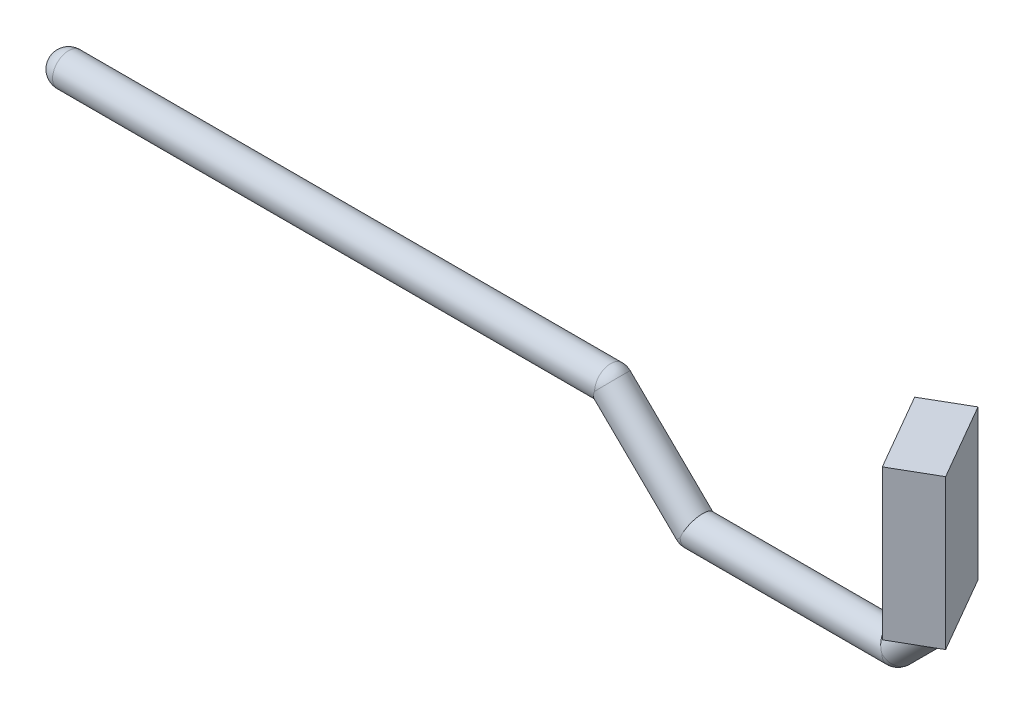
ISO-10303-21;
HEADER;
FILE_DESCRIPTION(('STEP AP214'),'2;1');
FILE_NAME('part.step','',(''),(''),'','','');
FILE_SCHEMA(('AUTOMOTIVE_DESIGN { 1 0 10303 214 1 1 1 1 }'));
ENDSEC;
DATA;
#1=APPLICATION_CONTEXT('core data for automotive mechanical design processes');
#2=APPLICATION_PROTOCOL_DEFINITION('international standard','automotive_design',2000,#1);
#3=PRODUCT_CONTEXT('',#1,'mechanical');
#4=PRODUCT('Part','Part','',(#3));
#5=PRODUCT_RELATED_PRODUCT_CATEGORY('part','',(#4));
#6=PRODUCT_DEFINITION_FORMATION('','',#4);
#7=PRODUCT_DEFINITION_CONTEXT('part definition',#1,'design');
#8=PRODUCT_DEFINITION('design','',#6,#7);
#9=PRODUCT_DEFINITION_SHAPE('','',#8);
#10=(LENGTH_UNIT() NAMED_UNIT(*) SI_UNIT(.MILLI.,.METRE.));
#11=(NAMED_UNIT(*) PLANE_ANGLE_UNIT() SI_UNIT($,.RADIAN.));
#12=(NAMED_UNIT(*) SI_UNIT($,.STERADIAN.) SOLID_ANGLE_UNIT());
#13=UNCERTAINTY_MEASURE_WITH_UNIT(LENGTH_MEASURE(1.E-05),#10,'distance_accuracy_value','');
#14=(GEOMETRIC_REPRESENTATION_CONTEXT(3) GLOBAL_UNCERTAINTY_ASSIGNED_CONTEXT((#13)) GLOBAL_UNIT_ASSIGNED_CONTEXT((#10,
#11,#12)) REPRESENTATION_CONTEXT('',''));
#15=CARTESIAN_POINT('',(0.,0.,0.));
#16=DIRECTION('',(0.,0.,1.));
#17=DIRECTION('',(1.,0.,0.));
#18=AXIS2_PLACEMENT_3D('',#15,#16,#17);
#19=CARTESIAN_POINT('',(62.,-60.75,197.625));
#20=DIRECTION('',(0.,0.,1.));
#21=DIRECTION('',(1.,0.,0.));
#22=AXIS2_PLACEMENT_3D('',#19,#20,#21);
#23=SPHERICAL_SURFACE('',#22,2.25);
#24=CARTESIAN_POINT('',(62.,-60.75,197.625));
#25=DIRECTION('',(-1.,0.,0.));
#26=DIRECTION('',(0.,0.,-1.));
#27=AXIS2_PLACEMENT_3D('',#24,#25,#26);
#28=SPHERICAL_SURFACE('',#27,2.25);
#29=CARTESIAN_POINT('',(62.,-60.75,197.625));
#30=DIRECTION('',(-1.,0.,0.));
#31=DIRECTION('',(0.,0.,-1.));
#32=AXIS2_PLACEMENT_3D('',#29,#30,#31);
#33=CIRCLE('',#32,2.25);
#34=CARTESIAN_POINT('',(62.,-60.75,195.375));
#35=VERTEX_POINT('',#34);
#36=CARTESIAN_POINT('',(62.,-60.75,199.875));
#37=VERTEX_POINT('',#36);
#38=EDGE_CURVE('E9',#35,#37,#33,.T.);
#39=ORIENTED_EDGE('',*,*,#38,.T.);
#40=CARTESIAN_POINT('',(62.,-60.75,197.625));
#41=DIRECTION('',(-1.,0.,0.));
#42=DIRECTION('',(0.,0.,-1.));
#43=AXIS2_PLACEMENT_3D('',#40,#41,#42);
#44=CIRCLE('',#43,2.25);
#45=EDGE_CURVE('E25',#37,#35,#44,.T.);
#46=ORIENTED_EDGE('',*,*,#45,.T.);
#47=EDGE_LOOP('',(#39,#46));
#48=FACE_BOUND('',#47,.T.);
#49=ADVANCED_FACE('F14',(#48),#28,.T.);
#50=CARTESIAN_POINT('',(138.,-60.75,197.625));
#51=DIRECTION('',(-1.,0.,0.));
#52=DIRECTION('',(0.,0.,-1.));
#53=AXIS2_PLACEMENT_3D('',#50,#51,#52);
#54=CYLINDRICAL_SURFACE('',#53,2.25);
#55=CARTESIAN_POINT('',(138.,-60.75,197.625));
#56=DIRECTION('',(-1.,0.,0.));
#57=DIRECTION('',(0.,0.,-1.));
#58=AXIS2_PLACEMENT_3D('',#55,#56,#57);
#59=CIRCLE('',#58,2.25);
#60=CARTESIAN_POINT('',(138.,-60.75,199.875));
#61=VERTEX_POINT('',#60);
#62=CARTESIAN_POINT('',(138.,-60.75,195.375));
#63=VERTEX_POINT('',#62);
#64=EDGE_CURVE('E167',#61,#63,#59,.T.);
#65=ORIENTED_EDGE('',*,*,#64,.T.);
#66=DIRECTION('',(-1.,0.,0.));
#67=VECTOR('',#66,1.);
#68=CARTESIAN_POINT('',(138.,-60.75,195.375));
#69=LINE('',#68,#67);
#70=EDGE_CURVE('E163',#63,#35,#69,.T.);
#71=ORIENTED_EDGE('',*,*,#70,.T.);
#72=ORIENTED_EDGE('',*,*,#45,.F.);
#73=ORIENTED_EDGE('',*,*,#38,.F.);
#74=ORIENTED_EDGE('',*,*,#70,.F.);
#75=CARTESIAN_POINT('',(138.,-60.75,197.625));
#76=DIRECTION('',(-0.925880777015539,0.37781581061822,0.));
#77=DIRECTION('',(0.37781581061822,0.925880777015539,0.));
#78=AXIS2_PLACEMENT_3D('',#75,#76,#77);
#79=ELLIPSE('',#78,2.430118494579,2.25);
#80=CARTESIAN_POINT('',(137.08186281107,-62.99999999999,197.625));
#81=VERTEX_POINT('',#80);
#82=EDGE_CURVE('E212',#63,#81,#79,.T.);
#83=ORIENTED_EDGE('',*,*,#82,.T.);
#84=CARTESIAN_POINT('',(138.,-60.75,197.625));
#85=DIRECTION('',(-0.925880777015539,0.37781581061822,0.));
#86=DIRECTION('',(0.37781581061822,0.925880777015539,0.));
#87=AXIS2_PLACEMENT_3D('',#84,#85,#86);
#88=ELLIPSE('',#87,2.430118494579,2.25);
#89=EDGE_CURVE('E227',#81,#61,#88,.T.);
#90=ORIENTED_EDGE('',*,*,#89,.T.);
#91=EDGE_LOOP('',(#65,#71,#72,#73,#74,#83,#90));
#92=FACE_BOUND('',#91,.T.);
#93=ADVANCED_FACE('F262',(#92),#54,.T.);
#94=CARTESIAN_POINT('',(138.,-60.75,197.625));
#95=DIRECTION('',(0.,0.,1.));
#96=DIRECTION('',(1.,0.,0.));
#97=AXIS2_PLACEMENT_3D('',#94,#95,#96);
#98=SPHERICAL_SURFACE('',#97,2.25);
#99=CARTESIAN_POINT('',(138.,-60.75,197.625));
#100=DIRECTION('',(-0.714510426493359,0.699624792608351,0.));
#101=DIRECTION('',(-0.699624792608351,-0.714510426493359,0.));
#102=AXIS2_PLACEMENT_3D('',#99,#100,#101);
#103=CIRCLE('',#102,2.25);
#104=EDGE_CURVE('E223',#61,#63,#103,.T.);
#105=ORIENTED_EDGE('',*,*,#104,.T.);
#106=ORIENTED_EDGE('',*,*,#64,.F.);
#107=EDGE_LOOP('',(#105,#106));
#108=FACE_BOUND('',#107,.T.);
#109=ADVANCED_FACE('F269',(#108),#98,.T.);
#110=CARTESIAN_POINT('',(150.,-72.5,197.625));
#111=DIRECTION('',(-0.714510426493359,0.699624792608351,0.));
#112=DIRECTION('',(-0.699624792608351,-0.714510426493359,0.));
#113=AXIS2_PLACEMENT_3D('',#110,#111,#112);
#114=CYLINDRICAL_SURFACE('',#113,2.25);
#115=ORIENTED_EDGE('',*,*,#104,.F.);
#116=ORIENTED_EDGE('',*,*,#89,.F.);
#117=DIRECTION('',(-0.714510426493359,0.699624792608351,0.));
#118=VECTOR('',#117,1.);
#119=CARTESIAN_POINT('',(148.42584421663,-74.10764845961,197.625));
#120=LINE('',#119,#118);
#121=CARTESIAN_POINT('',(148.42584421663,-74.10764845961,197.625));
#122=VERTEX_POINT('',#121);
#123=EDGE_CURVE('E230',#122,#81,#120,.T.);
#124=ORIENTED_EDGE('',*,*,#123,.F.);
#125=CARTESIAN_POINT('',(150.,-72.5,197.625));
#126=DIRECTION('',(-0.714510426493359,0.699624792608351,0.));
#127=DIRECTION('',(-0.699624792608351,-0.714510426493359,0.));
#128=AXIS2_PLACEMENT_3D('',#125,#126,#127);
#129=CIRCLE('',#128,2.25);
#130=CARTESIAN_POINT('',(150.,-72.5,199.875));
#131=VERTEX_POINT('',#130);
#132=EDGE_CURVE('E121',#122,#131,#129,.T.);
#133=ORIENTED_EDGE('',*,*,#132,.T.);
#134=CARTESIAN_POINT('',(150.,-72.5,197.625));
#135=DIRECTION('',(-0.925880777015539,0.37781581061822,0.));
#136=DIRECTION('',(-0.37781581061822,-0.925880777015539,0.));
#137=AXIS2_PLACEMENT_3D('',#134,#135,#136);
#138=ELLIPSE('',#137,2.430118494579,2.25);
#139=CARTESIAN_POINT('',(150.,-72.5,195.375));
#140=VERTEX_POINT('',#139);
#141=EDGE_CURVE('E133',#131,#140,#138,.T.);
#142=ORIENTED_EDGE('',*,*,#141,.T.);
#143=CARTESIAN_POINT('',(150.,-72.5,197.625));
#144=DIRECTION('',(-0.714510426493359,0.699624792608351,0.));
#145=DIRECTION('',(-0.699624792608351,-0.714510426493359,0.));
#146=AXIS2_PLACEMENT_3D('',#143,#144,#145);
#147=CIRCLE('',#146,2.25);
#148=EDGE_CURVE('E18',#140,#122,#147,.T.);
#149=ORIENTED_EDGE('',*,*,#148,.T.);
#150=ORIENTED_EDGE('',*,*,#123,.T.);
#151=ORIENTED_EDGE('',*,*,#82,.F.);
#152=EDGE_LOOP('',(#115,#116,#124,#133,#142,#149,#150,#151));
#153=FACE_BOUND('',#152,.T.);
#154=ADVANCED_FACE('F259',(#153),#114,.T.);
#155=CARTESIAN_POINT('',(150.,-72.5,197.625));
#156=DIRECTION('',(0.,0.,1.));
#157=DIRECTION('',(1.,0.,0.));
#158=AXIS2_PLACEMENT_3D('',#155,#156,#157);
#159=SPHERICAL_SURFACE('',#158,2.25);
#160=CARTESIAN_POINT('',(150.,-72.5,197.625));
#161=DIRECTION('',(-1.,0.,0.));
#162=DIRECTION('',(0.,0.,-1.));
#163=AXIS2_PLACEMENT_3D('',#160,#161,#162);
#164=CIRCLE('',#163,2.25);
#165=EDGE_CURVE('E122',#140,#131,#164,.T.);
#166=ORIENTED_EDGE('',*,*,#165,.T.);
#167=ORIENTED_EDGE('',*,*,#132,.F.);
#168=ORIENTED_EDGE('',*,*,#148,.F.);
#169=EDGE_LOOP('',(#166,#167,#168));
#170=FACE_BOUND('',#169,.T.);
#171=ADVANCED_FACE('F275',(#170),#159,.T.);
#172=CARTESIAN_POINT('',(178.30125416358,-72.5,197.625));
#173=DIRECTION('',(0.,0.,1.));
#174=DIRECTION('',(1.,0.,0.));
#175=AXIS2_PLACEMENT_3D('',#172,#173,#174);
#176=SPHERICAL_SURFACE('',#175,2.25);
#177=CARTESIAN_POINT('',(178.30125416358,-72.5,197.625));
#178=DIRECTION('',(-0.707106781186548,-0.707106781186548,0.));
#179=DIRECTION('',(-0.707106781186548,0.707106781186548,0.));
#180=AXIS2_PLACEMENT_3D('',#177,#178,#179);
#181=CIRCLE('',#180,2.25);
#182=CARTESIAN_POINT('',(178.30125416358,-72.5,195.375));
#183=VERTEX_POINT('',#182);
#184=CARTESIAN_POINT('',(178.30125416358,-72.5,199.875));
#185=VERTEX_POINT('',#184);
#186=EDGE_CURVE('E116',#183,#185,#181,.T.);
#187=ORIENTED_EDGE('',*,*,#186,.T.);
#188=CARTESIAN_POINT('',(178.30125416358,-72.5,197.625));
#189=DIRECTION('',(-1.,0.,0.));
#190=DIRECTION('',(0.,0.,-1.));
#191=AXIS2_PLACEMENT_3D('',#188,#189,#190);
#192=CIRCLE('',#191,2.25);
#193=EDGE_CURVE('E112',#183,#185,#192,.T.);
#194=ORIENTED_EDGE('',*,*,#193,.F.);
#195=EDGE_LOOP('',(#187,#194));
#196=FACE_BOUND('',#195,.T.);
#197=ADVANCED_FACE('F114',(#196),#176,.T.);
#198=CARTESIAN_POINT('',(178.30125416358,-72.5,197.625));
#199=DIRECTION('',(-1.,0.,0.));
#200=DIRECTION('',(0.,0.,-1.));
#201=AXIS2_PLACEMENT_3D('',#198,#199,#200);
#202=CYLINDRICAL_SURFACE('',#201,2.25);
#203=CARTESIAN_POINT('',(178.30125416358,-72.5,197.625));
#204=DIRECTION('',(-0.923879532511277,-0.382683432365114,0.));
#205=DIRECTION('',(0.382683432365114,-0.923879532511277,0.));
#206=AXIS2_PLACEMENT_3D('',#203,#204,#205);
#207=ELLIPSE('',#206,2.435382450658,2.25);
#208=CARTESIAN_POINT('',(177.36927364824,-70.24999999999,197.625));
#209=VERTEX_POINT('',#208);
#210=EDGE_CURVE('E136',#185,#209,#207,.T.);
#211=ORIENTED_EDGE('',*,*,#210,.T.);
#212=CARTESIAN_POINT('',(178.30125416358,-72.5,197.625));
#213=DIRECTION('',(-0.923879532511277,-0.382683432365114,0.));
#214=DIRECTION('',(0.382683432365114,-0.923879532511277,0.));
#215=AXIS2_PLACEMENT_3D('',#212,#213,#214);
#216=ELLIPSE('',#215,2.435382450658,2.25);
#217=EDGE_CURVE('E134',#209,#183,#216,.T.);
#218=ORIENTED_EDGE('',*,*,#217,.T.);
#219=DIRECTION('',(-1.,0.,0.));
#220=VECTOR('',#219,1.);
#221=CARTESIAN_POINT('',(178.30125416358,-72.5,195.375));
#222=LINE('',#221,#220);
#223=EDGE_CURVE('E126',#183,#140,#222,.T.);
#224=ORIENTED_EDGE('',*,*,#223,.T.);
#225=ORIENTED_EDGE('',*,*,#141,.F.);
#226=ORIENTED_EDGE('',*,*,#165,.F.);
#227=ORIENTED_EDGE('',*,*,#223,.F.);
#228=ORIENTED_EDGE('',*,*,#193,.T.);
#229=EDGE_LOOP('',(#211,#218,#224,#225,#226,#227,#228));
#230=FACE_BOUND('',#229,.T.);
#231=ADVANCED_FACE('F128',(#230),#202,.T.);
#232=CARTESIAN_POINT('',(182.80125416358,-68.,197.625));
#233=DIRECTION('',(-0.707106781186548,-0.707106781186548,0.));
#234=DIRECTION('',(-0.707106781186548,0.707106781186548,0.));
#235=AXIS2_PLACEMENT_3D('',#232,#233,#234);
#236=CYLINDRICAL_SURFACE('',#235,2.25);
#237=CARTESIAN_POINT('',(182.80125416358,-68.,197.625));
#238=DIRECTION('',(-0.382683432365114,-0.923879532511277,0.));
#239=DIRECTION('',(0.923879532511277,-0.382683432365114,0.));
#240=AXIS2_PLACEMENT_3D('',#237,#238,#239);
#241=ELLIPSE('',#240,2.435382450658,2.25);
#242=CARTESIAN_POINT('',(182.80125416358,-68.,199.875));
#243=VERTEX_POINT('',#242);
#244=CARTESIAN_POINT('',(180.55125416358,-67.06801948466,197.625));
#245=VERTEX_POINT('',#244);
#246=EDGE_CURVE('E177',#243,#245,#241,.T.);
#247=ORIENTED_EDGE('',*,*,#246,.T.);
#248=DIRECTION('',(-0.707106781186548,-0.707106781186548,0.));
#249=VECTOR('',#248,1.);
#250=CARTESIAN_POINT('',(181.21026390591,-66.40900974233,197.625));
#251=LINE('',#250,#249);
#252=EDGE_CURVE('E149',#245,#209,#251,.T.);
#253=ORIENTED_EDGE('',*,*,#252,.T.);
#254=ORIENTED_EDGE('',*,*,#210,.F.);
#255=ORIENTED_EDGE('',*,*,#186,.F.);
#256=ORIENTED_EDGE('',*,*,#217,.F.);
#257=ORIENTED_EDGE('',*,*,#252,.F.);
#258=CARTESIAN_POINT('',(182.80125416358,-68.,197.625));
#259=DIRECTION('',(-0.382683432365114,-0.923879532511277,0.));
#260=DIRECTION('',(0.923879532511277,-0.382683432365114,0.));
#261=AXIS2_PLACEMENT_3D('',#258,#259,#260);
#262=ELLIPSE('',#261,2.435382450658,2.25);
#263=CARTESIAN_POINT('',(182.80125416358,-68.,195.375));
#264=VERTEX_POINT('',#263);
#265=EDGE_CURVE('E185',#245,#264,#262,.T.);
#266=ORIENTED_EDGE('',*,*,#265,.T.);
#267=CARTESIAN_POINT('',(182.80125416358,-68.,197.625));
#268=DIRECTION('',(-0.707106781186548,-0.707106781186548,0.));
#269=DIRECTION('',(-0.707106781186548,0.707106781186548,0.));
#270=AXIS2_PLACEMENT_3D('',#267,#268,#269);
#271=CIRCLE('',#270,2.25);
#272=EDGE_CURVE('E172',#264,#243,#271,.T.);
#273=ORIENTED_EDGE('',*,*,#272,.T.);
#274=EDGE_LOOP('',(#247,#253,#254,#255,#256,#257,#266,#273));
#275=FACE_BOUND('',#274,.T.);
#276=ADVANCED_FACE('F143',(#275),#236,.T.);
#277=CARTESIAN_POINT('',(182.80125416358,-68.,197.625));
#278=DIRECTION('',(0.,0.,1.));
#279=DIRECTION('',(1.,0.,0.));
#280=AXIS2_PLACEMENT_3D('',#277,#278,#279);
#281=SPHERICAL_SURFACE('',#280,2.25);
#282=CARTESIAN_POINT('',(182.80125416358,-68.,197.625));
#283=DIRECTION('',(0.,-1.,0.));
#284=DIRECTION('',(0.,0.,-1.));
#285=AXIS2_PLACEMENT_3D('',#282,#283,#284);
#286=CIRCLE('',#285,2.25);
#287=EDGE_CURVE('E173',#264,#243,#286,.T.);
#288=ORIENTED_EDGE('',*,*,#287,.T.);
#289=ORIENTED_EDGE('',*,*,#272,.F.);
#290=EDGE_LOOP('',(#288,#289));
#291=FACE_BOUND('',#290,.T.);
#292=ADVANCED_FACE('F286',(#291),#281,.T.);
#293=CARTESIAN_POINT('',(182.80125416358,-66.,197.625));
#294=DIRECTION('',(0.,-1.,0.));
#295=DIRECTION('',(0.,0.,-1.));
#296=AXIS2_PLACEMENT_3D('',#293,#294,#295);
#297=CYLINDRICAL_SURFACE('',#296,2.25);
#298=DIRECTION('',(0.,-1.,0.));
#299=VECTOR('',#298,1.);
#300=CARTESIAN_POINT('',(182.80125416358,-66.,195.375));
#301=LINE('',#300,#299);
#302=CARTESIAN_POINT('',(182.80125416358,-66.,195.375));
#303=VERTEX_POINT('',#302);
#304=EDGE_CURVE('E189',#303,#264,#301,.T.);
#305=ORIENTED_EDGE('',*,*,#304,.F.);
#306=CARTESIAN_POINT('',(182.80125416358,-66.,197.625));
#307=DIRECTION('',(0.,-1.,0.));
#308=DIRECTION('',(0.,0.,-1.));
#309=AXIS2_PLACEMENT_3D('',#306,#307,#308);
#310=CIRCLE('',#309,2.25);
#311=EDGE_CURVE('E161',#303,#303,#310,.T.);
#312=ORIENTED_EDGE('',*,*,#311,.T.);
#313=ORIENTED_EDGE('',*,*,#304,.T.);
#314=ORIENTED_EDGE('',*,*,#265,.F.);
#315=ORIENTED_EDGE('',*,*,#246,.F.);
#316=ORIENTED_EDGE('',*,*,#287,.F.);
#317=EDGE_LOOP('',(#305,#312,#313,#314,#315,#316));
#318=FACE_BOUND('',#317,.T.);
#319=ADVANCED_FACE('F360',(#318),#297,.T.);
#320=CARTESIAN_POINT('',(182.51583672588,-66.,190.63064249653));
#321=DIRECTION('',(0.866025403784329,0.,-0.50000000000019));
#322=DIRECTION('',(0.,-1.,0.));
#323=AXIS2_PLACEMENT_3D('',#320,#321,#322);
#324=PLANE('',#323);
#325=DIRECTION('',(0.50000000000019,0.,0.866025403784329));
#326=VECTOR('',#325,1.);
#327=CARTESIAN_POINT('',(182.51583672588,-66.,190.63064249653));
#328=LINE('',#327,#326);
#329=CARTESIAN_POINT('',(182.51583672588,-66.,190.63064249653));
#330=VERTEX_POINT('',#329);
#331=CARTESIAN_POINT('',(188.71583672588,-66.,201.36935750346));
#332=VERTEX_POINT('',#331);
#333=EDGE_CURVE('E190',#330,#332,#328,.T.);
#334=ORIENTED_EDGE('',*,*,#333,.F.);
#335=DIRECTION('',(0.,1.,0.));
#336=VECTOR('',#335,1.);
#337=CARTESIAN_POINT('',(182.51583672588,-66.,190.63064249653));
#338=LINE('',#337,#336);
#339=CARTESIAN_POINT('',(182.51583672588,-45.,190.63064249653));
#340=VERTEX_POINT('',#339);
#341=EDGE_CURVE('E202',#330,#340,#338,.T.);
#342=ORIENTED_EDGE('',*,*,#341,.T.);
#343=DIRECTION('',(0.50000000000019,0.,0.866025403784329));
#344=VECTOR('',#343,1.);
#345=CARTESIAN_POINT('',(182.51583672588,-45.,190.63064249653));
#346=LINE('',#345,#344);
#347=CARTESIAN_POINT('',(188.71583672588,-45.,201.36935750346));
#348=VERTEX_POINT('',#347);
#349=EDGE_CURVE('E180',#340,#348,#346,.T.);
#350=ORIENTED_EDGE('',*,*,#349,.T.);
#351=DIRECTION('',(0.,1.,0.));
#352=VECTOR('',#351,1.);
#353=CARTESIAN_POINT('',(188.71583672588,-66.,201.36935750346));
#354=LINE('',#353,#352);
#355=EDGE_CURVE('E155',#332,#348,#354,.T.);
#356=ORIENTED_EDGE('',*,*,#355,.F.);
#357=EDGE_LOOP('',(#334,#342,#350,#356));
#358=FACE_BOUND('',#357,.T.);
#359=ADVANCED_FACE('F273',(#358),#324,.T.);
#360=CARTESIAN_POINT('',(176.88667160128,-66.,193.88064249653));
#361=DIRECTION('',(0.50000000000019,0.,0.866025403784329));
#362=DIRECTION('',(0.,-1.,0.));
#363=AXIS2_PLACEMENT_3D('',#360,#361,#362);
#364=PLANE('',#363);
#365=DIRECTION('',(0.866025403784329,0.,-0.50000000000019));
#366=VECTOR('',#365,1.);
#367=CARTESIAN_POINT('',(176.88667160128,-45.,193.88064249653));
#368=LINE('',#367,#366);
#369=CARTESIAN_POINT('',(176.88667160128,-45.,193.88064249653));
#370=VERTEX_POINT('',#369);
#371=EDGE_CURVE('E154',#370,#340,#368,.T.);
#372=ORIENTED_EDGE('',*,*,#371,.T.);
#373=ORIENTED_EDGE('',*,*,#341,.F.);
#374=DIRECTION('',(0.866025403784329,0.,-0.50000000000019));
#375=VECTOR('',#374,1.);
#376=CARTESIAN_POINT('',(176.88667160128,-66.,193.88064249653));
#377=LINE('',#376,#375);
#378=CARTESIAN_POINT('',(176.88667160128,-66.,193.88064249653));
#379=VERTEX_POINT('',#378);
#380=EDGE_CURVE('E157',#379,#330,#377,.T.);
#381=ORIENTED_EDGE('',*,*,#380,.F.);
#382=DIRECTION('',(0.,1.,0.));
#383=VECTOR('',#382,1.);
#384=CARTESIAN_POINT('',(176.88667160128,-66.,193.88064249653));
#385=LINE('',#384,#383);
#386=EDGE_CURVE('E195',#379,#370,#385,.T.);
#387=ORIENTED_EDGE('',*,*,#386,.T.);
#388=EDGE_LOOP('',(#372,#373,#381,#387));
#389=FACE_BOUND('',#388,.T.);
#390=ADVANCED_FACE('F293',(#389),#364,.F.);
#391=CARTESIAN_POINT('',(176.88667160128,-45.,193.88064249653));
#392=DIRECTION('',(0.,1.,0.));
#393=DIRECTION('',(1.,0.,0.));
#394=AXIS2_PLACEMENT_3D('',#391,#392,#393);
#395=PLANE('',#394);
#396=ORIENTED_EDGE('',*,*,#371,.F.);
#397=DIRECTION('',(0.50000000000019,0.,0.866025403784329));
#398=VECTOR('',#397,1.);
#399=CARTESIAN_POINT('',(176.88667160128,-45.,193.88064249653));
#400=LINE('',#399,#398);
#401=CARTESIAN_POINT('',(183.08667160128,-45.,204.61935750346));
#402=VERTEX_POINT('',#401);
#403=EDGE_CURVE('E199',#370,#402,#400,.T.);
#404=ORIENTED_EDGE('',*,*,#403,.T.);
#405=DIRECTION('',(0.866025403784329,0.,-0.50000000000019));
#406=VECTOR('',#405,1.);
#407=CARTESIAN_POINT('',(183.08667160128,-45.,204.61935750346));
#408=LINE('',#407,#406);
#409=EDGE_CURVE('E152',#402,#348,#408,.T.);
#410=ORIENTED_EDGE('',*,*,#409,.T.);
#411=ORIENTED_EDGE('',*,*,#349,.F.);
#412=EDGE_LOOP('',(#396,#404,#410,#411));
#413=FACE_BOUND('',#412,.T.);
#414=ADVANCED_FACE('F290',(#413),#395,.T.);
#415=CARTESIAN_POINT('',(183.08667160128,-66.,204.61935750346));
#416=DIRECTION('',(0.50000000000019,0.,0.866025403784329));
#417=DIRECTION('',(0.,-1.,0.));
#418=AXIS2_PLACEMENT_3D('',#415,#416,#417);
#419=PLANE('',#418);
#420=DIRECTION('',(0.,1.,0.));
#421=VECTOR('',#420,1.);
#422=CARTESIAN_POINT('',(183.08667160128,-66.,204.61935750346));
#423=LINE('',#422,#421);
#424=CARTESIAN_POINT('',(183.08667160128,-66.,204.61935750346));
#425=VERTEX_POINT('',#424);
#426=EDGE_CURVE('E208',#425,#402,#423,.T.);
#427=ORIENTED_EDGE('',*,*,#426,.F.);
#428=DIRECTION('',(0.866025403784329,0.,-0.50000000000019));
#429=VECTOR('',#428,1.);
#430=CARTESIAN_POINT('',(183.08667160128,-66.,204.61935750346));
#431=LINE('',#430,#429);
#432=EDGE_CURVE('E162',#425,#332,#431,.T.);
#433=ORIENTED_EDGE('',*,*,#432,.T.);
#434=ORIENTED_EDGE('',*,*,#355,.T.);
#435=ORIENTED_EDGE('',*,*,#409,.F.);
#436=EDGE_LOOP('',(#427,#433,#434,#435));
#437=FACE_BOUND('',#436,.T.);
#438=ADVANCED_FACE('F292',(#437),#419,.T.);
#439=CARTESIAN_POINT('',(176.88667160128,-66.,193.88064249653));
#440=DIRECTION('',(0.,1.,0.));
#441=DIRECTION('',(1.,0.,0.));
#442=AXIS2_PLACEMENT_3D('',#439,#440,#441);
#443=PLANE('',#442);
#444=ORIENTED_EDGE('',*,*,#311,.F.);
#445=EDGE_LOOP('',(#444));
#446=FACE_BOUND('',#445,.T.);
#447=ORIENTED_EDGE('',*,*,#333,.T.);
#448=ORIENTED_EDGE('',*,*,#432,.F.);
#449=DIRECTION('',(0.50000000000019,0.,0.866025403784329));
#450=VECTOR('',#449,1.);
#451=CARTESIAN_POINT('',(176.88667160128,-66.,193.88064249653));
#452=LINE('',#451,#450);
#453=EDGE_CURVE('E194',#379,#425,#452,.T.);
#454=ORIENTED_EDGE('',*,*,#453,.F.);
#455=ORIENTED_EDGE('',*,*,#380,.T.);
#456=EDGE_LOOP('',(#447,#448,#454,#455));
#457=FACE_BOUND('',#456,.T.);
#458=ADVANCED_FACE('F299',(#446,#457),#443,.F.);
#459=CARTESIAN_POINT('',(176.88667160128,-66.,193.88064249653));
#460=DIRECTION('',(0.866025403784329,0.,-0.50000000000019));
#461=DIRECTION('',(0.,-1.,0.));
#462=AXIS2_PLACEMENT_3D('',#459,#460,#461);
#463=PLANE('',#462);
#464=ORIENTED_EDGE('',*,*,#426,.T.);
#465=ORIENTED_EDGE('',*,*,#403,.F.);
#466=ORIENTED_EDGE('',*,*,#386,.F.);
#467=ORIENTED_EDGE('',*,*,#453,.T.);
#468=EDGE_LOOP('',(#464,#465,#466,#467));
#469=FACE_BOUND('',#468,.T.);
#470=ADVANCED_FACE('F16',(#469),#463,.F.);
#471=CLOSED_SHELL('',(#49,#93,#109,#154,#171,#197,#231,#276,#292,#319,#359,#390,#414,#438,#458,#470));
#472=MANIFOLD_SOLID_BREP('B1',#471);
#473=ADVANCED_BREP_SHAPE_REPRESENTATION('',(#18,#472),#14);
#474=SHAPE_DEFINITION_REPRESENTATION(#9,#473);
ENDSEC;
END-ISO-10303-21;
